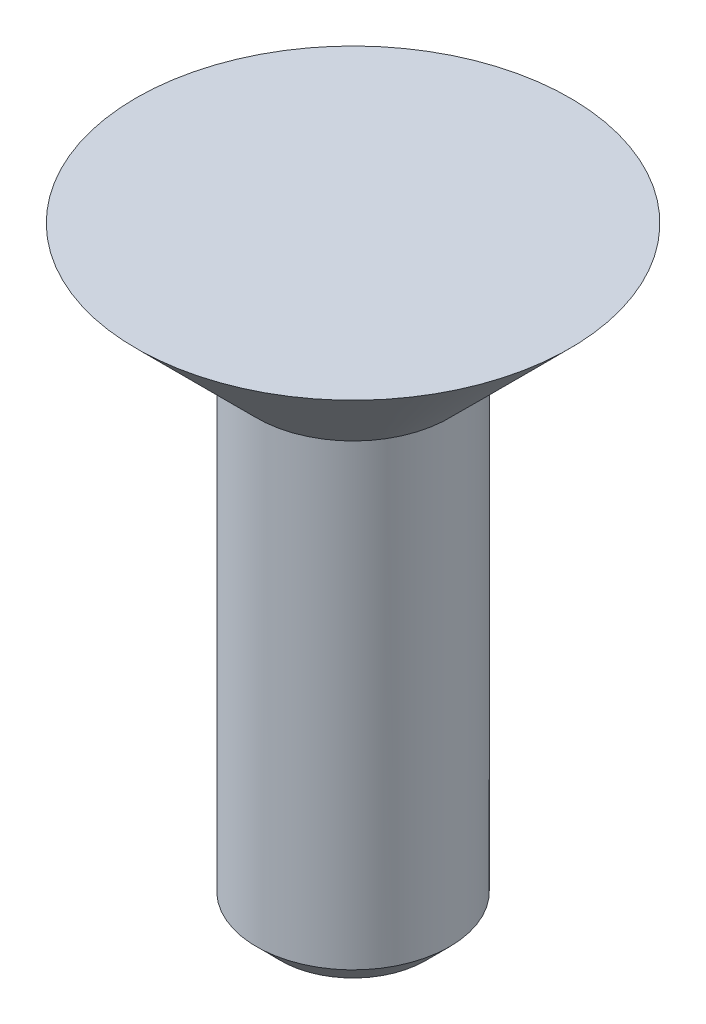
ISO-10303-21;
HEADER;
FILE_DESCRIPTION(('STEP AP214'),'2;1');
FILE_NAME('part.step','',(''),(''),'','','');
FILE_SCHEMA(('AUTOMOTIVE_DESIGN { 1 0 10303 214 1 1 1 1 }'));
ENDSEC;
DATA;
#1=APPLICATION_CONTEXT('core data for automotive mechanical design processes');
#2=APPLICATION_PROTOCOL_DEFINITION('international standard','automotive_design',2000,#1);
#3=PRODUCT_CONTEXT('',#1,'mechanical');
#4=PRODUCT('Part','Part','',(#3));
#5=PRODUCT_RELATED_PRODUCT_CATEGORY('part','',(#4));
#6=PRODUCT_DEFINITION_FORMATION('','',#4);
#7=PRODUCT_DEFINITION_CONTEXT('part definition',#1,'design');
#8=PRODUCT_DEFINITION('design','',#6,#7);
#9=PRODUCT_DEFINITION_SHAPE('','',#8);
#10=(LENGTH_UNIT() NAMED_UNIT(*) SI_UNIT(.MILLI.,.METRE.));
#11=(NAMED_UNIT(*) PLANE_ANGLE_UNIT() SI_UNIT($,.RADIAN.));
#12=(NAMED_UNIT(*) SI_UNIT($,.STERADIAN.) SOLID_ANGLE_UNIT());
#13=UNCERTAINTY_MEASURE_WITH_UNIT(LENGTH_MEASURE(1.E-05),#10,'distance_accuracy_value','');
#14=(GEOMETRIC_REPRESENTATION_CONTEXT(3) GLOBAL_UNCERTAINTY_ASSIGNED_CONTEXT((#13)) GLOBAL_UNIT_ASSIGNED_CONTEXT((#10,
#11,#12)) REPRESENTATION_CONTEXT('',''));
#15=CARTESIAN_POINT('',(0.,0.,0.));
#16=DIRECTION('',(0.,0.,1.));
#17=DIRECTION('',(1.,0.,0.));
#18=AXIS2_PLACEMENT_3D('',#15,#16,#17);
#19=CARTESIAN_POINT('',(0.,0.,0.));
#20=DIRECTION('',(0.,1.,0.));
#21=DIRECTION('',(-1.,0.,0.));
#22=AXIS2_PLACEMENT_3D('',#19,#20,#21);
#23=PLANE('',#22);
#24=CARTESIAN_POINT('',(0.,0.,0.));
#25=DIRECTION('',(0.,1.,0.));
#26=DIRECTION('',(-1.,0.,0.));
#27=AXIS2_PLACEMENT_3D('',#24,#25,#26);
#28=CIRCLE('',#27,1.8);
#29=CARTESIAN_POINT('',(-1.8,0.,0.));
#30=VERTEX_POINT('',#29);
#31=EDGE_CURVE('E25',#30,#30,#28,.T.);
#32=ORIENTED_EDGE('',*,*,#31,.T.);
#33=EDGE_LOOP('',(#32));
#34=FACE_BOUND('',#33,.T.);
#35=ADVANCED_FACE('F14',(#34),#23,.T.);
#36=CARTESIAN_POINT('',(0.,0.,0.));
#37=DIRECTION('',(0.,1.,0.));
#38=DIRECTION('',(-1.,0.,0.));
#39=AXIS2_PLACEMENT_3D('',#36,#37,#38);
#40=CONICAL_SURFACE('',#39,1.8,0.785398163397443);
#41=CARTESIAN_POINT('',(0.,-1.,0.));
#42=DIRECTION('',(0.,1.,0.));
#43=DIRECTION('',(-1.,0.,0.));
#44=AXIS2_PLACEMENT_3D('',#41,#42,#43);
#45=CIRCLE('',#44,0.8);
#46=CARTESIAN_POINT('',(-0.799999999999998,-1.,0.));
#47=VERTEX_POINT('',#46);
#48=EDGE_CURVE('E29',#47,#47,#45,.T.);
#49=ORIENTED_EDGE('',*,*,#48,.T.);
#50=EDGE_LOOP('',(#49));
#51=FACE_BOUND('',#50,.T.);
#52=ORIENTED_EDGE('',*,*,#31,.F.);
#53=EDGE_LOOP('',(#52));
#54=FACE_BOUND('',#53,.T.);
#55=ADVANCED_FACE('F35',(#51,#54),#40,.T.);
#56=CARTESIAN_POINT('',(0.,-5.,0.));
#57=DIRECTION('',(0.,1.,0.));
#58=DIRECTION('',(-1.,0.,0.));
#59=AXIS2_PLACEMENT_3D('',#56,#57,#58);
#60=CYLINDRICAL_SURFACE('',#59,0.8);
#61=CARTESIAN_POINT('',(0.,-4.8,0.));
#62=DIRECTION('',(0.,-1.,0.));
#63=DIRECTION('',(1.,0.,0.));
#64=AXIS2_PLACEMENT_3D('',#61,#62,#63);
#65=CIRCLE('',#64,0.8);
#66=CARTESIAN_POINT('',(0.800000000000002,-4.8,0.));
#67=VERTEX_POINT('',#66);
#68=EDGE_CURVE('E21',#67,#67,#65,.F.);
#69=ORIENTED_EDGE('',*,*,#68,.T.);
#70=EDGE_LOOP('',(#69));
#71=FACE_BOUND('',#70,.T.);
#72=ORIENTED_EDGE('',*,*,#48,.F.);
#73=EDGE_LOOP('',(#72));
#74=FACE_BOUND('',#73,.T.);
#75=ADVANCED_FACE('F38',(#71,#74),#60,.T.);
#76=CARTESIAN_POINT('',(-0.8,-5.,0.));
#77=DIRECTION('',(0.,-1.,0.));
#78=DIRECTION('',(1.,0.,0.));
#79=AXIS2_PLACEMENT_3D('',#76,#77,#78);
#80=PLANE('',#79);
#81=CARTESIAN_POINT('',(0.,-5.,0.));
#82=DIRECTION('',(0.,-1.,0.));
#83=DIRECTION('',(1.,0.,0.));
#84=AXIS2_PLACEMENT_3D('',#81,#82,#83);
#85=CIRCLE('',#84,0.6);
#86=CARTESIAN_POINT('',(0.600000000000001,-5.,0.));
#87=VERTEX_POINT('',#86);
#88=EDGE_CURVE('E10',#87,#87,#85,.T.);
#89=ORIENTED_EDGE('',*,*,#88,.T.);
#90=EDGE_LOOP('',(#89));
#91=FACE_BOUND('',#90,.T.);
#92=ADVANCED_FACE('F40',(#91),#80,.T.);
#93=CARTESIAN_POINT('',(0.,-4.8,0.));
#94=DIRECTION('',(0.,1.,0.));
#95=DIRECTION('',(-1.,0.,0.));
#96=AXIS2_PLACEMENT_3D('',#93,#94,#95);
#97=CONICAL_SURFACE('',#96,0.8,0.785398163397452);
#98=ORIENTED_EDGE('',*,*,#88,.F.);
#99=EDGE_LOOP('',(#98));
#100=FACE_BOUND('',#99,.T.);
#101=ORIENTED_EDGE('',*,*,#68,.F.);
#102=EDGE_LOOP('',(#101));
#103=FACE_BOUND('',#102,.T.);
#104=ADVANCED_FACE('F16',(#100,#103),#97,.T.);
#105=CLOSED_SHELL('',(#35,#55,#75,#92,#104));
#106=MANIFOLD_SOLID_BREP('B1',#105);
#107=ADVANCED_BREP_SHAPE_REPRESENTATION('',(#18,#106),#14);
#108=SHAPE_DEFINITION_REPRESENTATION(#9,#107);
ENDSEC;
END-ISO-10303-21;
